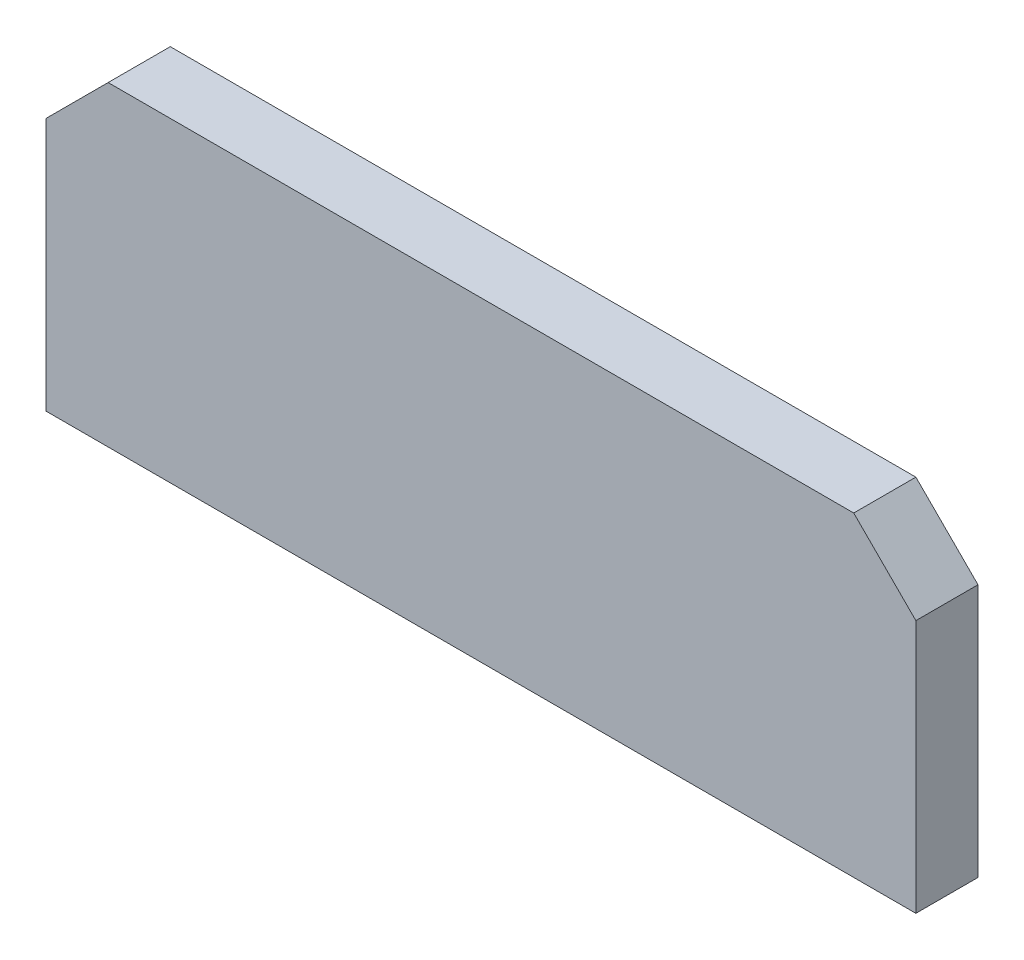
ISO-10303-21;
HEADER;
FILE_DESCRIPTION(('STEP AP214'),'2;1');
FILE_NAME('part.step','',(''),(''),'','','');
FILE_SCHEMA(('AUTOMOTIVE_DESIGN { 1 0 10303 214 1 1 1 1 }'));
ENDSEC;
DATA;
#1=APPLICATION_CONTEXT('core data for automotive mechanical design processes');
#2=APPLICATION_PROTOCOL_DEFINITION('international standard','automotive_design',2000,#1);
#3=PRODUCT_CONTEXT('',#1,'mechanical');
#4=PRODUCT('Part','Part','',(#3));
#5=PRODUCT_RELATED_PRODUCT_CATEGORY('part','',(#4));
#6=PRODUCT_DEFINITION_FORMATION('','',#4);
#7=PRODUCT_DEFINITION_CONTEXT('part definition',#1,'design');
#8=PRODUCT_DEFINITION('design','',#6,#7);
#9=PRODUCT_DEFINITION_SHAPE('','',#8);
#10=(LENGTH_UNIT() NAMED_UNIT(*) SI_UNIT(.MILLI.,.METRE.));
#11=(NAMED_UNIT(*) PLANE_ANGLE_UNIT() SI_UNIT($,.RADIAN.));
#12=(NAMED_UNIT(*) SI_UNIT($,.STERADIAN.) SOLID_ANGLE_UNIT());
#13=UNCERTAINTY_MEASURE_WITH_UNIT(LENGTH_MEASURE(1.E-05),#10,'distance_accuracy_value','');
#14=(GEOMETRIC_REPRESENTATION_CONTEXT(3) GLOBAL_UNCERTAINTY_ASSIGNED_CONTEXT((#13)) GLOBAL_UNIT_ASSIGNED_CONTEXT((#10,
#11,#12)) REPRESENTATION_CONTEXT('',''));
#15=CARTESIAN_POINT('',(0.,0.,0.));
#16=DIRECTION('',(0.,0.,1.));
#17=DIRECTION('',(1.,0.,0.));
#18=AXIS2_PLACEMENT_3D('',#15,#16,#17);
#19=CARTESIAN_POINT('',(70.,-25.4,10.));
#20=DIRECTION('',(-1.,0.,0.));
#21=DIRECTION('',(0.,0.,1.));
#22=AXIS2_PLACEMENT_3D('',#19,#20,#21);
#23=PLANE('',#22);
#24=DIRECTION('',(0.,1.,0.));
#25=VECTOR('',#24,1.);
#26=CARTESIAN_POINT('',(70.,-25.4,0.));
#27=LINE('',#26,#25);
#28=CARTESIAN_POINT('',(70.,-25.4,0.));
#29=VERTEX_POINT('',#28);
#30=CARTESIAN_POINT('',(70.,15.4,0.));
#31=VERTEX_POINT('',#30);
#32=EDGE_CURVE('E117',#29,#31,#27,.T.);
#33=ORIENTED_EDGE('',*,*,#32,.T.);
#34=DIRECTION('',(0.,0.,-1.));
#35=VECTOR('',#34,1.);
#36=CARTESIAN_POINT('',(70.,15.4,10.));
#37=LINE('',#36,#35);
#38=CARTESIAN_POINT('',(70.,15.4,10.));
#39=VERTEX_POINT('',#38);
#40=EDGE_CURVE('E11',#39,#31,#37,.T.);
#41=ORIENTED_EDGE('',*,*,#40,.F.);
#42=DIRECTION('',(0.,1.,0.));
#43=VECTOR('',#42,1.);
#44=CARTESIAN_POINT('',(70.,-25.4,10.));
#45=LINE('',#44,#43);
#46=CARTESIAN_POINT('',(70.,-25.4,10.));
#47=VERTEX_POINT('',#46);
#48=EDGE_CURVE('E127',#47,#39,#45,.T.);
#49=ORIENTED_EDGE('',*,*,#48,.F.);
#50=DIRECTION('',(0.,0.,-1.));
#51=VECTOR('',#50,1.);
#52=CARTESIAN_POINT('',(70.,-25.4,10.));
#53=LINE('',#52,#51);
#54=EDGE_CURVE('E113',#47,#29,#53,.T.);
#55=ORIENTED_EDGE('',*,*,#54,.T.);
#56=EDGE_LOOP('',(#33,#41,#49,#55));
#57=FACE_BOUND('',#56,.T.);
#58=ADVANCED_FACE('F33',(#57),#23,.F.);
#59=CARTESIAN_POINT('',(70.,15.4,10.));
#60=DIRECTION('',(-0.707106781186547,-0.707106781186548,0.));
#61=DIRECTION('',(0.707106781186548,-0.707106781186547,0.));
#62=AXIS2_PLACEMENT_3D('',#59,#60,#61);
#63=PLANE('',#62);
#64=DIRECTION('',(-0.707106781186548,0.707106781186547,0.));
#65=VECTOR('',#64,1.);
#66=CARTESIAN_POINT('',(70.,15.4,0.));
#67=LINE('',#66,#65);
#68=CARTESIAN_POINT('',(60.,25.4,0.));
#69=VERTEX_POINT('',#68);
#70=EDGE_CURVE('E120',#31,#69,#67,.T.);
#71=ORIENTED_EDGE('',*,*,#70,.T.);
#72=DIRECTION('',(0.,0.,-1.));
#73=VECTOR('',#72,1.);
#74=CARTESIAN_POINT('',(60.,25.4,10.));
#75=LINE('',#74,#73);
#76=CARTESIAN_POINT('',(60.,25.4,10.));
#77=VERTEX_POINT('',#76);
#78=EDGE_CURVE('E41',#77,#69,#75,.T.);
#79=ORIENTED_EDGE('',*,*,#78,.F.);
#80=DIRECTION('',(-0.707106781186548,0.707106781186547,0.));
#81=VECTOR('',#80,1.);
#82=CARTESIAN_POINT('',(70.,15.4,10.));
#83=LINE('',#82,#81);
#84=EDGE_CURVE('E86',#39,#77,#83,.T.);
#85=ORIENTED_EDGE('',*,*,#84,.F.);
#86=ORIENTED_EDGE('',*,*,#40,.T.);
#87=EDGE_LOOP('',(#71,#79,#85,#86));
#88=FACE_BOUND('',#87,.T.);
#89=ADVANCED_FACE('F151',(#88),#63,.F.);
#90=CARTESIAN_POINT('',(60.,25.4,10.));
#91=DIRECTION('',(0.,-1.,0.));
#92=DIRECTION('',(1.,0.,0.));
#93=AXIS2_PLACEMENT_3D('',#90,#91,#92);
#94=PLANE('',#93);
#95=DIRECTION('',(-1.,0.,0.));
#96=VECTOR('',#95,1.);
#97=CARTESIAN_POINT('',(60.,25.4,0.));
#98=LINE('',#97,#96);
#99=CARTESIAN_POINT('',(-60.,25.4,0.));
#100=VERTEX_POINT('',#99);
#101=EDGE_CURVE('E122',#69,#100,#98,.T.);
#102=ORIENTED_EDGE('',*,*,#101,.T.);
#103=DIRECTION('',(0.,0.,-1.));
#104=VECTOR('',#103,1.);
#105=CARTESIAN_POINT('',(-60.,25.4,10.));
#106=LINE('',#105,#104);
#107=CARTESIAN_POINT('',(-60.,25.4,10.));
#108=VERTEX_POINT('',#107);
#109=EDGE_CURVE('E108',#108,#100,#106,.T.);
#110=ORIENTED_EDGE('',*,*,#109,.F.);
#111=DIRECTION('',(-1.,0.,0.));
#112=VECTOR('',#111,1.);
#113=CARTESIAN_POINT('',(60.,25.4,10.));
#114=LINE('',#113,#112);
#115=EDGE_CURVE('E99',#77,#108,#114,.T.);
#116=ORIENTED_EDGE('',*,*,#115,.F.);
#117=ORIENTED_EDGE('',*,*,#78,.T.);
#118=EDGE_LOOP('',(#102,#110,#116,#117));
#119=FACE_BOUND('',#118,.T.);
#120=ADVANCED_FACE('F133',(#119),#94,.F.);
#121=CARTESIAN_POINT('',(-60.,25.4,10.));
#122=DIRECTION('',(0.707106781186548,-0.707106781186548,0.));
#123=DIRECTION('',(0.707106781186548,0.707106781186548,0.));
#124=AXIS2_PLACEMENT_3D('',#121,#122,#123);
#125=PLANE('',#124);
#126=DIRECTION('',(-0.707106781186548,-0.707106781186548,0.));
#127=VECTOR('',#126,1.);
#128=CARTESIAN_POINT('',(-60.,25.4,0.));
#129=LINE('',#128,#127);
#130=CARTESIAN_POINT('',(-70.,15.4,0.));
#131=VERTEX_POINT('',#130);
#132=EDGE_CURVE('E107',#100,#131,#129,.T.);
#133=ORIENTED_EDGE('',*,*,#132,.T.);
#134=DIRECTION('',(0.,0.,-1.));
#135=VECTOR('',#134,1.);
#136=CARTESIAN_POINT('',(-70.,15.4,10.));
#137=LINE('',#136,#135);
#138=CARTESIAN_POINT('',(-70.,15.4,10.));
#139=VERTEX_POINT('',#138);
#140=EDGE_CURVE('E104',#139,#131,#137,.T.);
#141=ORIENTED_EDGE('',*,*,#140,.F.);
#142=DIRECTION('',(-0.707106781186548,-0.707106781186548,0.));
#143=VECTOR('',#142,1.);
#144=CARTESIAN_POINT('',(-60.,25.4,10.));
#145=LINE('',#144,#143);
#146=EDGE_CURVE('E93',#108,#139,#145,.T.);
#147=ORIENTED_EDGE('',*,*,#146,.F.);
#148=ORIENTED_EDGE('',*,*,#109,.T.);
#149=EDGE_LOOP('',(#133,#141,#147,#148));
#150=FACE_BOUND('',#149,.T.);
#151=ADVANCED_FACE('F105',(#150),#125,.F.);
#152=CARTESIAN_POINT('',(-70.,-25.4,10.));
#153=DIRECTION('',(1.,0.,0.));
#154=DIRECTION('',(0.,0.,-1.));
#155=AXIS2_PLACEMENT_3D('',#152,#153,#154);
#156=PLANE('',#155);
#157=DIRECTION('',(0.,-1.,0.));
#158=VECTOR('',#157,1.);
#159=CARTESIAN_POINT('',(-70.,-25.4,0.));
#160=LINE('',#159,#158);
#161=CARTESIAN_POINT('',(-70.,-25.4,0.));
#162=VERTEX_POINT('',#161);
#163=EDGE_CURVE('E72',#131,#162,#160,.T.);
#164=ORIENTED_EDGE('',*,*,#163,.T.);
#165=DIRECTION('',(0.,0.,-1.));
#166=VECTOR('',#165,1.);
#167=CARTESIAN_POINT('',(-70.,-25.4,10.));
#168=LINE('',#167,#166);
#169=CARTESIAN_POINT('',(-70.,-25.4,10.));
#170=VERTEX_POINT('',#169);
#171=EDGE_CURVE('E109',#170,#162,#168,.T.);
#172=ORIENTED_EDGE('',*,*,#171,.F.);
#173=DIRECTION('',(0.,-1.,0.));
#174=VECTOR('',#173,1.);
#175=CARTESIAN_POINT('',(-70.,-25.4,10.));
#176=LINE('',#175,#174);
#177=EDGE_CURVE('E97',#139,#170,#176,.T.);
#178=ORIENTED_EDGE('',*,*,#177,.F.);
#179=ORIENTED_EDGE('',*,*,#140,.T.);
#180=EDGE_LOOP('',(#164,#172,#178,#179));
#181=FACE_BOUND('',#180,.T.);
#182=ADVANCED_FACE('F111',(#181),#156,.F.);
#183=CARTESIAN_POINT('',(70.,-25.4,10.));
#184=DIRECTION('',(0.,1.,0.));
#185=DIRECTION('',(-1.,0.,0.));
#186=AXIS2_PLACEMENT_3D('',#183,#184,#185);
#187=PLANE('',#186);
#188=DIRECTION('',(1.,0.,0.));
#189=VECTOR('',#188,1.);
#190=CARTESIAN_POINT('',(70.,-25.4,0.));
#191=LINE('',#190,#189);
#192=EDGE_CURVE('E78',#162,#29,#191,.T.);
#193=ORIENTED_EDGE('',*,*,#192,.T.);
#194=ORIENTED_EDGE('',*,*,#54,.F.);
#195=DIRECTION('',(1.,0.,0.));
#196=VECTOR('',#195,1.);
#197=CARTESIAN_POINT('',(70.,-25.4,10.));
#198=LINE('',#197,#196);
#199=EDGE_CURVE('E49',#170,#47,#198,.T.);
#200=ORIENTED_EDGE('',*,*,#199,.F.);
#201=ORIENTED_EDGE('',*,*,#171,.T.);
#202=EDGE_LOOP('',(#193,#194,#200,#201));
#203=FACE_BOUND('',#202,.T.);
#204=ADVANCED_FACE('F140',(#203),#187,.F.);
#205=CARTESIAN_POINT('',(0.,0.,10.));
#206=DIRECTION('',(0.,0.,1.));
#207=DIRECTION('',(1.,0.,0.));
#208=AXIS2_PLACEMENT_3D('',#205,#206,#207);
#209=PLANE('',#208);
#210=ORIENTED_EDGE('',*,*,#48,.T.);
#211=ORIENTED_EDGE('',*,*,#84,.T.);
#212=ORIENTED_EDGE('',*,*,#115,.T.);
#213=ORIENTED_EDGE('',*,*,#146,.T.);
#214=ORIENTED_EDGE('',*,*,#177,.T.);
#215=ORIENTED_EDGE('',*,*,#199,.T.);
#216=EDGE_LOOP('',(#210,#211,#212,#213,#214,#215));
#217=FACE_BOUND('',#216,.T.);
#218=ADVANCED_FACE('F95',(#217),#209,.T.);
#219=CARTESIAN_POINT('',(0.,0.,0.));
#220=DIRECTION('',(0.,0.,1.));
#221=DIRECTION('',(1.,0.,0.));
#222=AXIS2_PLACEMENT_3D('',#219,#220,#221);
#223=PLANE('',#222);
#224=ORIENTED_EDGE('',*,*,#32,.F.);
#225=ORIENTED_EDGE('',*,*,#192,.F.);
#226=ORIENTED_EDGE('',*,*,#163,.F.);
#227=ORIENTED_EDGE('',*,*,#132,.F.);
#228=ORIENTED_EDGE('',*,*,#101,.F.);
#229=ORIENTED_EDGE('',*,*,#70,.F.);
#230=EDGE_LOOP('',(#224,#225,#226,#227,#228,#229));
#231=FACE_BOUND('',#230,.T.);
#232=ADVANCED_FACE('F136',(#231),#223,.F.);
#233=CLOSED_SHELL('',(#58,#89,#120,#151,#182,#204,#218,#232));
#234=MANIFOLD_SOLID_BREP('B2',#233);
#235=ADVANCED_BREP_SHAPE_REPRESENTATION('',(#18,#234),#14);
#236=SHAPE_DEFINITION_REPRESENTATION(#9,#235);
ENDSEC;
END-ISO-10303-21;
